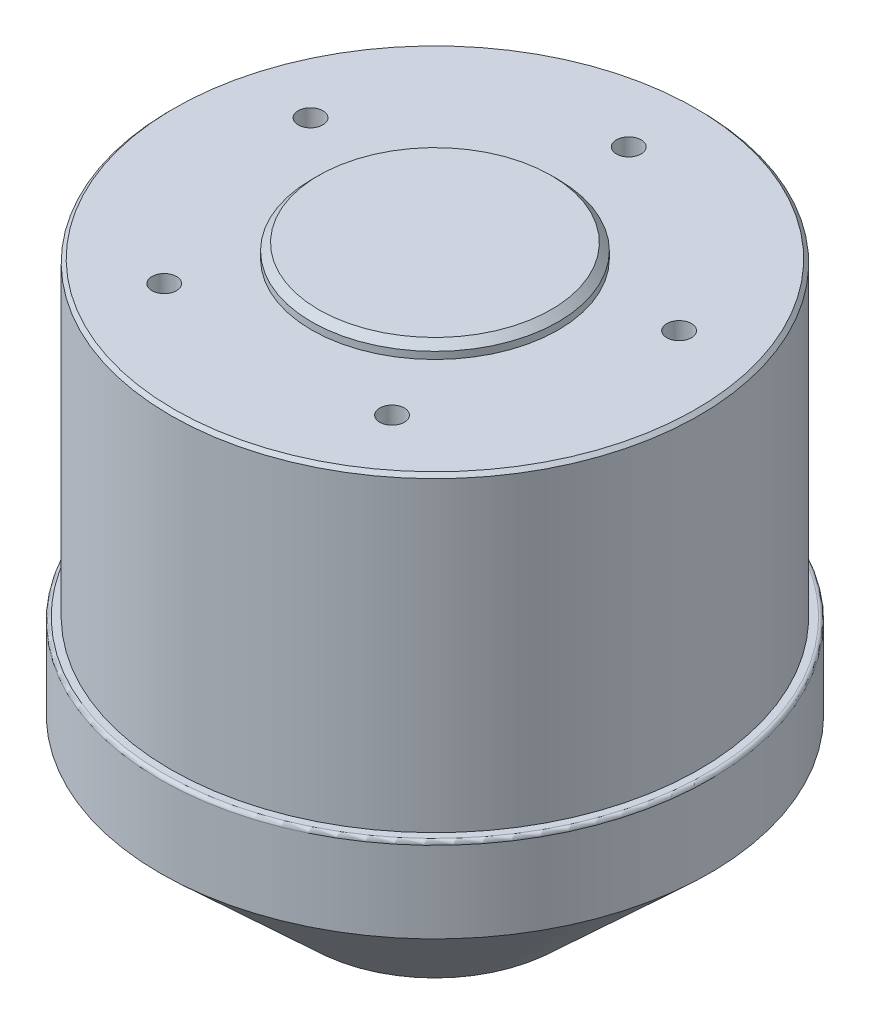
ISO-10303-21;
HEADER;
FILE_DESCRIPTION(('STEP AP214'),'2;1');
FILE_NAME('part.step','',(''),(''),'','','');
FILE_SCHEMA(('AUTOMOTIVE_DESIGN { 1 0 10303 214 1 1 1 1 }'));
ENDSEC;
DATA;
#1=APPLICATION_CONTEXT('core data for automotive mechanical design processes');
#2=APPLICATION_PROTOCOL_DEFINITION('international standard','automotive_design',2000,#1);
#3=PRODUCT_CONTEXT('',#1,'mechanical');
#4=PRODUCT('Part','Part','',(#3));
#5=PRODUCT_RELATED_PRODUCT_CATEGORY('part','',(#4));
#6=PRODUCT_DEFINITION_FORMATION('','',#4);
#7=PRODUCT_DEFINITION_CONTEXT('part definition',#1,'design');
#8=PRODUCT_DEFINITION('design','',#6,#7);
#9=PRODUCT_DEFINITION_SHAPE('','',#8);
#10=(LENGTH_UNIT() NAMED_UNIT(*) SI_UNIT(.MILLI.,.METRE.));
#11=(NAMED_UNIT(*) PLANE_ANGLE_UNIT() SI_UNIT($,.RADIAN.));
#12=(NAMED_UNIT(*) SI_UNIT($,.STERADIAN.) SOLID_ANGLE_UNIT());
#13=UNCERTAINTY_MEASURE_WITH_UNIT(LENGTH_MEASURE(1.E-05),#10,'distance_accuracy_value','');
#14=(GEOMETRIC_REPRESENTATION_CONTEXT(3) GLOBAL_UNCERTAINTY_ASSIGNED_CONTEXT((#13)) GLOBAL_UNIT_ASSIGNED_CONTEXT((#10,
#11,#12)) REPRESENTATION_CONTEXT('',''));
#15=CARTESIAN_POINT('',(0.,0.,0.));
#16=DIRECTION('',(0.,0.,1.));
#17=DIRECTION('',(1.,0.,0.));
#18=AXIS2_PLACEMENT_3D('',#15,#16,#17);
#19=CARTESIAN_POINT('',(0.,76.,0.));
#20=DIRECTION('',(0.,-1.,0.));
#21=DIRECTION('',(0.,0.,-1.));
#22=AXIS2_PLACEMENT_3D('',#19,#20,#21);
#23=CYLINDRICAL_SURFACE('',#22,37.5);
#24=CARTESIAN_POINT('',(0.,75.5,0.));
#25=DIRECTION('',(0.,1.,0.));
#26=DIRECTION('',(0.,0.,1.));
#27=AXIS2_PLACEMENT_3D('',#24,#25,#26);
#28=CIRCLE('',#27,37.5);
#29=CARTESIAN_POINT('',(0.,75.5,37.5));
#30=VERTEX_POINT('',#29);
#31=EDGE_CURVE('E72',#30,#30,#28,.F.);
#32=ORIENTED_EDGE('',*,*,#31,.T.);
#33=EDGE_LOOP('',(#32));
#34=FACE_BOUND('',#33,.T.);
#35=CARTESIAN_POINT('',(0.,32.,0.));
#36=DIRECTION('',(0.,1.,0.));
#37=DIRECTION('',(0.,0.,1.));
#38=AXIS2_PLACEMENT_3D('',#35,#36,#37);
#39=CIRCLE('',#38,37.5);
#40=CARTESIAN_POINT('',(0.,32.,37.5));
#41=VERTEX_POINT('',#40);
#42=EDGE_CURVE('E92',#41,#41,#39,.T.);
#43=ORIENTED_EDGE('',*,*,#42,.T.);
#44=EDGE_LOOP('',(#43));
#45=FACE_BOUND('',#44,.T.);
#46=ADVANCED_FACE('F47',(#34,#45),#23,.T.);
#47=CARTESIAN_POINT('',(0.,76.,0.));
#48=DIRECTION('',(0.,1.,0.));
#49=DIRECTION('',(0.,0.,1.));
#50=AXIS2_PLACEMENT_3D('',#47,#48,#49);
#51=PLANE('',#50);
#52=CARTESIAN_POINT('',(0.,76.,0.));
#53=DIRECTION('',(0.,1.,0.));
#54=DIRECTION('',(0.,0.,1.));
#55=AXIS2_PLACEMENT_3D('',#52,#53,#54);
#56=CIRCLE('',#55,37.);
#57=CARTESIAN_POINT('',(0.,76.,37.));
#58=VERTEX_POINT('',#57);
#59=EDGE_CURVE('E76',#58,#58,#56,.T.);
#60=ORIENTED_EDGE('',*,*,#59,.T.);
#61=EDGE_LOOP('',(#60));
#62=FACE_BOUND('',#61,.T.);
#63=CARTESIAN_POINT('',(0.,76.,-27.5));
#64=DIRECTION('',(0.,1.,0.));
#65=DIRECTION('',(0.,0.,1.));
#66=AXIS2_PLACEMENT_3D('',#63,#64,#65);
#67=CIRCLE('',#66,1.75);
#68=CARTESIAN_POINT('',(0.,76.,-25.75));
#69=VERTEX_POINT('',#68);
#70=EDGE_CURVE('E129',#69,#69,#67,.T.);
#71=ORIENTED_EDGE('',*,*,#70,.F.);
#72=EDGE_LOOP('',(#71));
#73=FACE_BOUND('',#72,.T.);
#74=CARTESIAN_POINT('',(26.1540541981167,76.,-8.49796734531098));
#75=DIRECTION('',(0.,1.,0.));
#76=DIRECTION('',(0.,0.,1.));
#77=AXIS2_PLACEMENT_3D('',#74,#75,#76);
#78=CIRCLE('',#77,1.75);
#79=CARTESIAN_POINT('',(26.1540541981167,76.,-6.74796734531098));
#80=VERTEX_POINT('',#79);
#81=EDGE_CURVE('E125',#80,#80,#78,.T.);
#82=ORIENTED_EDGE('',*,*,#81,.F.);
#83=EDGE_LOOP('',(#82));
#84=FACE_BOUND('',#83,.T.);
#85=CARTESIAN_POINT('',(16.1640944380429,76.,22.2479673453112));
#86=DIRECTION('',(0.,1.,0.));
#87=DIRECTION('',(0.,0.,1.));
#88=AXIS2_PLACEMENT_3D('',#85,#86,#87);
#89=CIRCLE('',#88,1.75);
#90=CARTESIAN_POINT('',(16.1640944380429,76.,23.9979673453112));
#91=VERTEX_POINT('',#90);
#92=EDGE_CURVE('E117',#91,#91,#89,.T.);
#93=ORIENTED_EDGE('',*,*,#92,.F.);
#94=EDGE_LOOP('',(#93));
#95=FACE_BOUND('',#94,.T.);
#96=CARTESIAN_POINT('',(-16.1640944380432,76.,22.2479673453109));
#97=DIRECTION('',(0.,1.,0.));
#98=DIRECTION('',(0.,0.,1.));
#99=AXIS2_PLACEMENT_3D('',#96,#97,#98);
#100=CIRCLE('',#99,1.75);
#101=CARTESIAN_POINT('',(-16.1640944380432,76.,23.9979673453109));
#102=VERTEX_POINT('',#101);
#103=EDGE_CURVE('E109',#102,#102,#100,.T.);
#104=ORIENTED_EDGE('',*,*,#103,.F.);
#105=EDGE_LOOP('',(#104));
#106=FACE_BOUND('',#105,.T.);
#107=CARTESIAN_POINT('',(-26.1540541981166,76.,-8.49796734531135));
#108=DIRECTION('',(0.,1.,0.));
#109=DIRECTION('',(0.,0.,1.));
#110=AXIS2_PLACEMENT_3D('',#107,#108,#109);
#111=CIRCLE('',#110,1.75);
#112=CARTESIAN_POINT('',(-26.1540541981166,76.,-6.74796734531135));
#113=VERTEX_POINT('',#112);
#114=EDGE_CURVE('E101',#113,#113,#111,.T.);
#115=ORIENTED_EDGE('',*,*,#114,.F.);
#116=EDGE_LOOP('',(#115));
#117=FACE_BOUND('',#116,.T.);
#118=CARTESIAN_POINT('',(0.,76.,0.));
#119=DIRECTION('',(0.,1.,0.));
#120=DIRECTION('',(0.,0.,1.));
#121=AXIS2_PLACEMENT_3D('',#118,#119,#120);
#122=CIRCLE('',#121,17.5);
#123=CARTESIAN_POINT('',(0.,76.,17.5));
#124=VERTEX_POINT('',#123);
#125=EDGE_CURVE('E88',#124,#124,#122,.T.);
#126=ORIENTED_EDGE('',*,*,#125,.F.);
#127=EDGE_LOOP('',(#126));
#128=FACE_BOUND('',#127,.T.);
#129=ADVANCED_FACE('F146',(#62,#73,#84,#95,#106,#117,#128),#51,.T.);
#130=CARTESIAN_POINT('',(0.,78.,0.));
#131=DIRECTION('',(0.,-1.,0.));
#132=DIRECTION('',(0.,0.,-1.));
#133=AXIS2_PLACEMENT_3D('',#130,#131,#132);
#134=CYLINDRICAL_SURFACE('',#133,17.5);
#135=CARTESIAN_POINT('',(0.,77.,0.));
#136=DIRECTION('',(0.,1.,0.));
#137=DIRECTION('',(0.,0.,1.));
#138=AXIS2_PLACEMENT_3D('',#135,#136,#137);
#139=CIRCLE('',#138,17.5);
#140=CARTESIAN_POINT('',(0.,77.,17.5));
#141=VERTEX_POINT('',#140);
#142=EDGE_CURVE('E10',#141,#141,#139,.F.);
#143=ORIENTED_EDGE('',*,*,#142,.T.);
#144=EDGE_LOOP('',(#143));
#145=FACE_BOUND('',#144,.T.);
#146=ORIENTED_EDGE('',*,*,#125,.T.);
#147=EDGE_LOOP('',(#146));
#148=FACE_BOUND('',#147,.T.);
#149=ADVANCED_FACE('F149',(#145,#148),#134,.T.);
#150=CARTESIAN_POINT('',(0.,78.,0.));
#151=DIRECTION('',(0.,1.,0.));
#152=DIRECTION('',(0.,0.,1.));
#153=AXIS2_PLACEMENT_3D('',#150,#151,#152);
#154=PLANE('',#153);
#155=CARTESIAN_POINT('',(0.,78.,0.));
#156=DIRECTION('',(0.,1.,0.));
#157=DIRECTION('',(0.,0.,1.));
#158=AXIS2_PLACEMENT_3D('',#155,#156,#157);
#159=CIRCLE('',#158,16.5);
#160=CARTESIAN_POINT('',(0.,78.,16.5));
#161=VERTEX_POINT('',#160);
#162=EDGE_CURVE('E56',#161,#161,#159,.T.);
#163=ORIENTED_EDGE('',*,*,#162,.T.);
#164=EDGE_LOOP('',(#163));
#165=FACE_BOUND('',#164,.T.);
#166=ADVANCED_FACE('F163',(#165),#154,.T.);
#167=CARTESIAN_POINT('',(0.,32.,0.));
#168=DIRECTION('',(0.,-1.,0.));
#169=DIRECTION('',(0.,0.,-1.));
#170=AXIS2_PLACEMENT_3D('',#167,#168,#169);
#171=CYLINDRICAL_SURFACE('',#170,39.);
#172=CARTESIAN_POINT('',(0.,20.0000000000001,0.));
#173=DIRECTION('',(0.,1.,0.));
#174=DIRECTION('',(0.,0.,1.));
#175=AXIS2_PLACEMENT_3D('',#172,#173,#174);
#176=CIRCLE('',#175,39.);
#177=CARTESIAN_POINT('',(0.,20.0000000000001,39.));
#178=VERTEX_POINT('',#177);
#179=EDGE_CURVE('E66',#178,#178,#176,.T.);
#180=ORIENTED_EDGE('',*,*,#179,.T.);
#181=EDGE_LOOP('',(#180));
#182=FACE_BOUND('',#181,.T.);
#183=CARTESIAN_POINT('',(0.,31.5,0.));
#184=DIRECTION('',(0.,1.,0.));
#185=DIRECTION('',(0.,0.,1.));
#186=AXIS2_PLACEMENT_3D('',#183,#184,#185);
#187=CIRCLE('',#186,39.);
#188=CARTESIAN_POINT('',(0.,31.5,39.));
#189=VERTEX_POINT('',#188);
#190=EDGE_CURVE('E80',#189,#189,#187,.F.);
#191=ORIENTED_EDGE('',*,*,#190,.T.);
#192=EDGE_LOOP('',(#191));
#193=FACE_BOUND('',#192,.T.);
#194=ADVANCED_FACE('F168',(#182,#193),#171,.T.);
#195=CARTESIAN_POINT('',(0.,32.,0.));
#196=DIRECTION('',(0.,1.,0.));
#197=DIRECTION('',(0.,0.,1.));
#198=AXIS2_PLACEMENT_3D('',#195,#196,#197);
#199=PLANE('',#198);
#200=CARTESIAN_POINT('',(0.,32.,0.));
#201=DIRECTION('',(0.,1.,0.));
#202=DIRECTION('',(0.,0.,1.));
#203=AXIS2_PLACEMENT_3D('',#200,#201,#202);
#204=CIRCLE('',#203,38.5);
#205=CARTESIAN_POINT('',(0.,32.,38.5));
#206=VERTEX_POINT('',#205);
#207=EDGE_CURVE('E84',#206,#206,#204,.T.);
#208=ORIENTED_EDGE('',*,*,#207,.T.);
#209=EDGE_LOOP('',(#208));
#210=FACE_BOUND('',#209,.T.);
#211=ORIENTED_EDGE('',*,*,#42,.F.);
#212=EDGE_LOOP('',(#211));
#213=FACE_BOUND('',#212,.T.);
#214=ADVANCED_FACE('F205',(#210,#213),#199,.T.);
#215=CARTESIAN_POINT('',(0.,0.,0.));
#216=DIRECTION('',(0.,1.,0.));
#217=DIRECTION('',(0.,0.,1.));
#218=AXIS2_PLACEMENT_3D('',#215,#216,#217);
#219=PLANE('',#218);
#220=CARTESIAN_POINT('',(0.,0.,0.));
#221=DIRECTION('',(0.,1.,0.));
#222=DIRECTION('',(0.,0.,1.));
#223=AXIS2_PLACEMENT_3D('',#220,#221,#222);
#224=CIRCLE('',#223,17.4999999999999);
#225=CARTESIAN_POINT('',(0.,0.,17.4999999999999));
#226=VERTEX_POINT('',#225);
#227=EDGE_CURVE('E61',#226,#226,#224,.F.);
#228=ORIENTED_EDGE('',*,*,#227,.T.);
#229=EDGE_LOOP('',(#228));
#230=FACE_BOUND('',#229,.T.);
#231=ADVANCED_FACE('F178',(#230),#219,.F.);
#232=CARTESIAN_POINT('',(-26.1540541981166,69.,-8.49796734531135));
#233=DIRECTION('',(0.,1.,0.));
#234=DIRECTION('',(0.,0.,1.));
#235=AXIS2_PLACEMENT_3D('',#232,#233,#234);
#236=CYLINDRICAL_SURFACE('',#235,1.75);
#237=CARTESIAN_POINT('',(-26.1540541981166,69.,-8.49796734531135));
#238=DIRECTION('',(0.,1.,0.));
#239=DIRECTION('',(0.,0.,1.));
#240=AXIS2_PLACEMENT_3D('',#237,#238,#239);
#241=CIRCLE('',#240,1.75);
#242=CARTESIAN_POINT('',(-26.1540541981166,69.,-6.74796734531135));
#243=VERTEX_POINT('',#242);
#244=EDGE_CURVE('E97',#243,#243,#241,.T.);
#245=ORIENTED_EDGE('',*,*,#244,.F.);
#246=EDGE_LOOP('',(#245));
#247=FACE_BOUND('',#246,.T.);
#248=ORIENTED_EDGE('',*,*,#114,.T.);
#249=EDGE_LOOP('',(#248));
#250=FACE_BOUND('',#249,.T.);
#251=ADVANCED_FACE('F218',(#247,#250),#236,.F.);
#252=CARTESIAN_POINT('',(-26.1540541981166,69.,-8.49796734531135));
#253=DIRECTION('',(0.,1.,0.));
#254=DIRECTION('',(0.,0.,1.));
#255=AXIS2_PLACEMENT_3D('',#252,#253,#254);
#256=PLANE('',#255);
#257=ORIENTED_EDGE('',*,*,#244,.T.);
#258=EDGE_LOOP('',(#257));
#259=FACE_BOUND('',#258,.T.);
#260=ADVANCED_FACE('F221',(#259),#256,.T.);
#261=CARTESIAN_POINT('',(-16.1640944380432,69.,22.2479673453109));
#262=DIRECTION('',(0.,1.,0.));
#263=DIRECTION('',(0.,0.,1.));
#264=AXIS2_PLACEMENT_3D('',#261,#262,#263);
#265=CYLINDRICAL_SURFACE('',#264,1.75);
#266=CARTESIAN_POINT('',(-16.1640944380432,69.,22.2479673453109));
#267=DIRECTION('',(0.,1.,0.));
#268=DIRECTION('',(0.,0.,1.));
#269=AXIS2_PLACEMENT_3D('',#266,#267,#268);
#270=CIRCLE('',#269,1.75);
#271=CARTESIAN_POINT('',(-16.1640944380432,69.,23.9979673453109));
#272=VERTEX_POINT('',#271);
#273=EDGE_CURVE('E105',#272,#272,#270,.T.);
#274=ORIENTED_EDGE('',*,*,#273,.F.);
#275=EDGE_LOOP('',(#274));
#276=FACE_BOUND('',#275,.T.);
#277=ORIENTED_EDGE('',*,*,#103,.T.);
#278=EDGE_LOOP('',(#277));
#279=FACE_BOUND('',#278,.T.);
#280=ADVANCED_FACE('F224',(#276,#279),#265,.F.);
#281=CARTESIAN_POINT('',(-16.1640944380432,69.,22.2479673453109));
#282=DIRECTION('',(0.,1.,0.));
#283=DIRECTION('',(0.,0.,1.));
#284=AXIS2_PLACEMENT_3D('',#281,#282,#283);
#285=PLANE('',#284);
#286=ORIENTED_EDGE('',*,*,#273,.T.);
#287=EDGE_LOOP('',(#286));
#288=FACE_BOUND('',#287,.T.);
#289=ADVANCED_FACE('F229',(#288),#285,.T.);
#290=CARTESIAN_POINT('',(16.1640944380429,69.,22.2479673453112));
#291=DIRECTION('',(0.,1.,0.));
#292=DIRECTION('',(0.,0.,1.));
#293=AXIS2_PLACEMENT_3D('',#290,#291,#292);
#294=CYLINDRICAL_SURFACE('',#293,1.75);
#295=CARTESIAN_POINT('',(16.1640944380429,69.,22.2479673453112));
#296=DIRECTION('',(0.,1.,0.));
#297=DIRECTION('',(0.,0.,1.));
#298=AXIS2_PLACEMENT_3D('',#295,#296,#297);
#299=CIRCLE('',#298,1.75);
#300=CARTESIAN_POINT('',(16.1640944380429,69.,23.9979673453112));
#301=VERTEX_POINT('',#300);
#302=EDGE_CURVE('E113',#301,#301,#299,.T.);
#303=ORIENTED_EDGE('',*,*,#302,.F.);
#304=EDGE_LOOP('',(#303));
#305=FACE_BOUND('',#304,.T.);
#306=ORIENTED_EDGE('',*,*,#92,.T.);
#307=EDGE_LOOP('',(#306));
#308=FACE_BOUND('',#307,.T.);
#309=ADVANCED_FACE('F232',(#305,#308),#294,.F.);
#310=CARTESIAN_POINT('',(16.1640944380429,69.,22.2479673453112));
#311=DIRECTION('',(0.,1.,0.));
#312=DIRECTION('',(0.,0.,1.));
#313=AXIS2_PLACEMENT_3D('',#310,#311,#312);
#314=PLANE('',#313);
#315=ORIENTED_EDGE('',*,*,#302,.T.);
#316=EDGE_LOOP('',(#315));
#317=FACE_BOUND('',#316,.T.);
#318=ADVANCED_FACE('F237',(#317),#314,.T.);
#319=CARTESIAN_POINT('',(26.1540541981167,69.,-8.49796734531098));
#320=DIRECTION('',(0.,1.,0.));
#321=DIRECTION('',(0.,0.,1.));
#322=AXIS2_PLACEMENT_3D('',#319,#320,#321);
#323=CYLINDRICAL_SURFACE('',#322,1.75);
#324=CARTESIAN_POINT('',(26.1540541981167,69.,-8.49796734531098));
#325=DIRECTION('',(0.,1.,0.));
#326=DIRECTION('',(0.,0.,1.));
#327=AXIS2_PLACEMENT_3D('',#324,#325,#326);
#328=CIRCLE('',#327,1.75);
#329=CARTESIAN_POINT('',(26.1540541981167,69.,-6.74796734531098));
#330=VERTEX_POINT('',#329);
#331=EDGE_CURVE('E121',#330,#330,#328,.T.);
#332=ORIENTED_EDGE('',*,*,#331,.F.);
#333=EDGE_LOOP('',(#332));
#334=FACE_BOUND('',#333,.T.);
#335=ORIENTED_EDGE('',*,*,#81,.T.);
#336=EDGE_LOOP('',(#335));
#337=FACE_BOUND('',#336,.T.);
#338=ADVANCED_FACE('F240',(#334,#337),#323,.F.);
#339=CARTESIAN_POINT('',(26.1540541981167,69.,-8.49796734531098));
#340=DIRECTION('',(0.,1.,0.));
#341=DIRECTION('',(0.,0.,1.));
#342=AXIS2_PLACEMENT_3D('',#339,#340,#341);
#343=PLANE('',#342);
#344=ORIENTED_EDGE('',*,*,#331,.T.);
#345=EDGE_LOOP('',(#344));
#346=FACE_BOUND('',#345,.T.);
#347=ADVANCED_FACE('F142',(#346),#343,.T.);
#348=CARTESIAN_POINT('',(0.,69.,-27.5));
#349=DIRECTION('',(0.,1.,0.));
#350=DIRECTION('',(0.,0.,1.));
#351=AXIS2_PLACEMENT_3D('',#348,#349,#350);
#352=CYLINDRICAL_SURFACE('',#351,1.75);
#353=CARTESIAN_POINT('',(0.,69.,-27.5));
#354=DIRECTION('',(0.,1.,0.));
#355=DIRECTION('',(0.,0.,1.));
#356=AXIS2_PLACEMENT_3D('',#353,#354,#355);
#357=CIRCLE('',#356,1.75);
#358=CARTESIAN_POINT('',(0.,69.,-25.75));
#359=VERTEX_POINT('',#358);
#360=EDGE_CURVE('E96',#359,#359,#357,.T.);
#361=ORIENTED_EDGE('',*,*,#360,.F.);
#362=EDGE_LOOP('',(#361));
#363=FACE_BOUND('',#362,.T.);
#364=ORIENTED_EDGE('',*,*,#70,.T.);
#365=EDGE_LOOP('',(#364));
#366=FACE_BOUND('',#365,.T.);
#367=ADVANCED_FACE('F139',(#363,#366),#352,.F.);
#368=CARTESIAN_POINT('',(0.,69.,-27.5));
#369=DIRECTION('',(0.,1.,0.));
#370=DIRECTION('',(0.,0.,1.));
#371=AXIS2_PLACEMENT_3D('',#368,#369,#370);
#372=PLANE('',#371);
#373=ORIENTED_EDGE('',*,*,#360,.T.);
#374=EDGE_LOOP('',(#373));
#375=FACE_BOUND('',#374,.T.);
#376=ADVANCED_FACE('F137',(#375),#372,.T.);
#377=CARTESIAN_POINT('',(0.,31.5,0.));
#378=DIRECTION('',(0.,1.,0.));
#379=DIRECTION('',(0.,0.,1.));
#380=AXIS2_PLACEMENT_3D('',#377,#378,#379);
#381=TOROIDAL_SURFACE('',#380,38.5,0.5);
#382=ORIENTED_EDGE('',*,*,#190,.F.);
#383=EDGE_LOOP('',(#382));
#384=FACE_BOUND('',#383,.T.);
#385=ORIENTED_EDGE('',*,*,#207,.F.);
#386=EDGE_LOOP('',(#385));
#387=FACE_BOUND('',#386,.T.);
#388=ADVANCED_FACE('F179',(#384,#387),#381,.T.);
#389=CARTESIAN_POINT('',(0.,76.,0.));
#390=DIRECTION('',(0.,-1.,0.));
#391=DIRECTION('',(0.,0.,-1.));
#392=AXIS2_PLACEMENT_3D('',#389,#390,#391);
#393=CONICAL_SURFACE('',#392,37.,0.785398163397448);
#394=ORIENTED_EDGE('',*,*,#31,.F.);
#395=EDGE_LOOP('',(#394));
#396=FACE_BOUND('',#395,.T.);
#397=ORIENTED_EDGE('',*,*,#59,.F.);
#398=EDGE_LOOP('',(#397));
#399=FACE_BOUND('',#398,.T.);
#400=ADVANCED_FACE('F182',(#396,#399),#393,.T.);
#401=CARTESIAN_POINT('',(0.,20.0000000000001,0.));
#402=DIRECTION('',(0.,1.,0.));
#403=DIRECTION('',(0.,0.,1.));
#404=AXIS2_PLACEMENT_3D('',#401,#402,#403);
#405=CONICAL_SURFACE('',#404,39.,0.821527013910224);
#406=ORIENTED_EDGE('',*,*,#227,.F.);
#407=EDGE_LOOP('',(#406));
#408=FACE_BOUND('',#407,.T.);
#409=ORIENTED_EDGE('',*,*,#179,.F.);
#410=EDGE_LOOP('',(#409));
#411=FACE_BOUND('',#410,.T.);
#412=ADVANCED_FACE('F189',(#408,#411),#405,.T.);
#413=CARTESIAN_POINT('',(0.,78.,0.));
#414=DIRECTION('',(0.,-1.,0.));
#415=DIRECTION('',(0.,0.,-1.));
#416=AXIS2_PLACEMENT_3D('',#413,#414,#415);
#417=CONICAL_SURFACE('',#416,16.5,0.785398163397443);
#418=ORIENTED_EDGE('',*,*,#142,.F.);
#419=EDGE_LOOP('',(#418));
#420=FACE_BOUND('',#419,.T.);
#421=ORIENTED_EDGE('',*,*,#162,.F.);
#422=EDGE_LOOP('',(#421));
#423=FACE_BOUND('',#422,.T.);
#424=ADVANCED_FACE('F50',(#420,#423),#417,.T.);
#425=CLOSED_SHELL('',(#46,#129,#149,#166,#194,#214,#231,#251,#260,#280,#289,#309,#318,#338,#347,
#367,#376,#388,#400,#412,#424));
#426=MANIFOLD_SOLID_BREP('B2',#425);
#427=ADVANCED_BREP_SHAPE_REPRESENTATION('',(#18,#426),#14);
#428=SHAPE_DEFINITION_REPRESENTATION(#9,#427);
ENDSEC;
END-ISO-10303-21;
